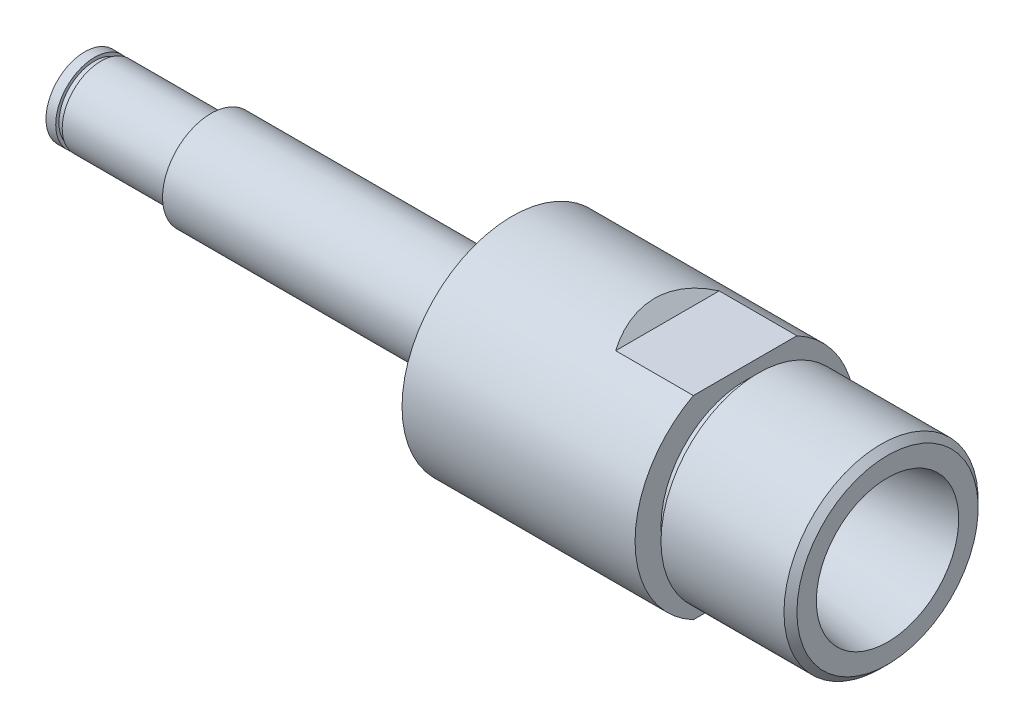
ISO-10303-21;
HEADER;
FILE_DESCRIPTION(('STEP AP214'),'2;1');
FILE_NAME('part.step','',(''),(''),'','','');
FILE_SCHEMA(('AUTOMOTIVE_DESIGN { 1 0 10303 214 1 1 1 1 }'));
ENDSEC;
DATA;
#1=APPLICATION_CONTEXT('core data for automotive mechanical design processes');
#2=APPLICATION_PROTOCOL_DEFINITION('international standard','automotive_design',2000,#1);
#3=PRODUCT_CONTEXT('',#1,'mechanical');
#4=PRODUCT('Part','Part','',(#3));
#5=PRODUCT_RELATED_PRODUCT_CATEGORY('part','',(#4));
#6=PRODUCT_DEFINITION_FORMATION('','',#4);
#7=PRODUCT_DEFINITION_CONTEXT('part definition',#1,'design');
#8=PRODUCT_DEFINITION('design','',#6,#7);
#9=PRODUCT_DEFINITION_SHAPE('','',#8);
#10=(LENGTH_UNIT() NAMED_UNIT(*) SI_UNIT(.MILLI.,.METRE.));
#11=(NAMED_UNIT(*) PLANE_ANGLE_UNIT() SI_UNIT($,.RADIAN.));
#12=(NAMED_UNIT(*) SI_UNIT($,.STERADIAN.) SOLID_ANGLE_UNIT());
#13=UNCERTAINTY_MEASURE_WITH_UNIT(LENGTH_MEASURE(1.E-05),#10,'distance_accuracy_value','');
#14=(GEOMETRIC_REPRESENTATION_CONTEXT(3) GLOBAL_UNCERTAINTY_ASSIGNED_CONTEXT((#13)) GLOBAL_UNIT_ASSIGNED_CONTEXT((#10,
#11,#12)) REPRESENTATION_CONTEXT('',''));
#15=CARTESIAN_POINT('',(0.,0.,0.));
#16=DIRECTION('',(0.,0.,1.));
#17=DIRECTION('',(1.,0.,0.));
#18=AXIS2_PLACEMENT_3D('',#15,#16,#17);
#19=CARTESIAN_POINT('',(-14.7147711853878,0.,0.));
#20=DIRECTION('',(-1.,0.,0.));
#21=DIRECTION('',(0.,0.,1.));
#22=AXIS2_PLACEMENT_3D('',#19,#20,#21);
#23=CYLINDRICAL_SURFACE('',#22,17.);
#24=CARTESIAN_POINT('',(39.0000000000001,0.,0.));
#25=DIRECTION('',(0.707106781186545,0.70710678118655,0.));
#26=DIRECTION('',(-0.70710678118655,0.707106781186545,0.));
#27=AXIS2_PLACEMENT_3D('',#24,#25,#26);
#28=ELLIPSE('',#27,24.0416305603427,17.);
#29=CARTESIAN_POINT('',(24.,15.,8.00000000000001));
#30=VERTEX_POINT('',#29);
#31=CARTESIAN_POINT('',(22.,17.,0.));
#32=VERTEX_POINT('',#31);
#33=EDGE_CURVE('E58',#30,#32,#28,.F.);
#34=ORIENTED_EDGE('',*,*,#33,.T.);
#35=CARTESIAN_POINT('',(39.0000000000001,0.,0.));
#36=DIRECTION('',(0.707106781186545,0.70710678118655,0.));
#37=DIRECTION('',(-0.70710678118655,0.707106781186545,0.));
#38=AXIS2_PLACEMENT_3D('',#35,#36,#37);
#39=ELLIPSE('',#38,24.0416305603427,17.);
#40=CARTESIAN_POINT('',(24.,15.,-8.));
#41=VERTEX_POINT('',#40);
#42=EDGE_CURVE('E96',#32,#41,#39,.F.);
#43=ORIENTED_EDGE('',*,*,#42,.T.);
#44=DIRECTION('',(1.,0.,0.));
#45=VECTOR('',#44,1.);
#46=CARTESIAN_POINT('',(22.,15.,-8.));
#47=LINE('',#46,#45);
#48=CARTESIAN_POINT('',(36.,15.,-8.));
#49=VERTEX_POINT('',#48);
#50=EDGE_CURVE('E91',#41,#49,#47,.T.);
#51=ORIENTED_EDGE('',*,*,#50,.T.);
#52=CARTESIAN_POINT('',(36.,0.,0.));
#53=DIRECTION('',(-1.,0.,0.));
#54=DIRECTION('',(0.,0.,1.));
#55=AXIS2_PLACEMENT_3D('',#52,#53,#54);
#56=CIRCLE('',#55,17.);
#57=CARTESIAN_POINT('',(36.,-15.,-8.));
#58=VERTEX_POINT('',#57);
#59=EDGE_CURVE('E95',#49,#58,#56,.T.);
#60=ORIENTED_EDGE('',*,*,#59,.T.);
#61=DIRECTION('',(1.,0.,0.));
#62=VECTOR('',#61,1.);
#63=CARTESIAN_POINT('',(22.,-15.,-8.));
#64=LINE('',#63,#62);
#65=CARTESIAN_POINT('',(24.,-15.,-8.));
#66=VERTEX_POINT('',#65);
#67=EDGE_CURVE('E101',#66,#58,#64,.T.);
#68=ORIENTED_EDGE('',*,*,#67,.F.);
#69=CARTESIAN_POINT('',(39.0000000000001,0.,0.));
#70=DIRECTION('',(0.707106781186545,-0.70710678118655,0.));
#71=DIRECTION('',(-0.70710678118655,-0.707106781186545,0.));
#72=AXIS2_PLACEMENT_3D('',#69,#70,#71);
#73=ELLIPSE('',#72,24.0416305603427,17.);
#74=CARTESIAN_POINT('',(22.,-17.,0.));
#75=VERTEX_POINT('',#74);
#76=EDGE_CURVE('E65',#66,#75,#73,.F.);
#77=ORIENTED_EDGE('',*,*,#76,.T.);
#78=CARTESIAN_POINT('',(39.0000000000001,0.,0.));
#79=DIRECTION('',(0.707106781186545,-0.70710678118655,0.));
#80=DIRECTION('',(-0.70710678118655,-0.707106781186545,0.));
#81=AXIS2_PLACEMENT_3D('',#78,#79,#80);
#82=ELLIPSE('',#81,24.0416305603427,17.);
#83=CARTESIAN_POINT('',(24.,-15.,8.));
#84=VERTEX_POINT('',#83);
#85=EDGE_CURVE('E133',#75,#84,#82,.F.);
#86=ORIENTED_EDGE('',*,*,#85,.T.);
#87=DIRECTION('',(1.,0.,0.));
#88=VECTOR('',#87,1.);
#89=CARTESIAN_POINT('',(22.,-15.,8.));
#90=LINE('',#89,#88);
#91=CARTESIAN_POINT('',(36.,-15.,8.));
#92=VERTEX_POINT('',#91);
#93=EDGE_CURVE('E109',#84,#92,#90,.T.);
#94=ORIENTED_EDGE('',*,*,#93,.T.);
#95=CARTESIAN_POINT('',(36.,15.,8.00000000000001));
#96=VERTEX_POINT('',#95);
#97=EDGE_CURVE('E116',#92,#96,#56,.T.);
#98=ORIENTED_EDGE('',*,*,#97,.T.);
#99=DIRECTION('',(1.,0.,0.));
#100=VECTOR('',#99,1.);
#101=CARTESIAN_POINT('',(22.,15.,8.00000000000001));
#102=LINE('',#101,#100);
#103=EDGE_CURVE('E100',#30,#96,#102,.T.);
#104=ORIENTED_EDGE('',*,*,#103,.F.);
#105=EDGE_LOOP('',(#34,#43,#51,#60,#68,#77,#86,#94,#98,#104));
#106=FACE_BOUND('',#105,.T.);
#107=CARTESIAN_POINT('',(0.,0.,0.));
#108=DIRECTION('',(-1.,0.,0.));
#109=DIRECTION('',(0.,0.,1.));
#110=AXIS2_PLACEMENT_3D('',#107,#108,#109);
#111=CIRCLE('',#110,17.);
#112=CARTESIAN_POINT('',(0.,0.,17.));
#113=VERTEX_POINT('',#112);
#114=EDGE_CURVE('E115',#113,#113,#111,.T.);
#115=ORIENTED_EDGE('',*,*,#114,.F.);
#116=EDGE_LOOP('',(#115));
#117=FACE_BOUND('',#116,.T.);
#118=ADVANCED_FACE('F42',(#106,#117),#23,.T.);
#119=CARTESIAN_POINT('',(36.,17.,0.));
#120=DIRECTION('',(-1.,0.,0.));
#121=DIRECTION('',(0.,0.,1.));
#122=AXIS2_PLACEMENT_3D('',#119,#120,#121);
#123=PLANE('',#122);
#124=CARTESIAN_POINT('',(36.,0.,0.));
#125=DIRECTION('',(-1.,0.,0.));
#126=DIRECTION('',(0.,0.,1.));
#127=AXIS2_PLACEMENT_3D('',#124,#125,#126);
#128=CIRCLE('',#127,13.);
#129=CARTESIAN_POINT('',(36.,0.,13.));
#130=VERTEX_POINT('',#129);
#131=EDGE_CURVE('E121',#130,#130,#128,.T.);
#132=ORIENTED_EDGE('',*,*,#131,.T.);
#133=EDGE_LOOP('',(#132));
#134=FACE_BOUND('',#133,.T.);
#135=DIRECTION('',(0.,0.,1.));
#136=VECTOR('',#135,1.);
#137=CARTESIAN_POINT('',(36.,15.,8.00000000000001));
#138=LINE('',#137,#136);
#139=EDGE_CURVE('E104',#49,#96,#138,.T.);
#140=ORIENTED_EDGE('',*,*,#139,.T.);
#141=ORIENTED_EDGE('',*,*,#97,.F.);
#142=DIRECTION('',(0.,0.,-1.));
#143=VECTOR('',#142,1.);
#144=CARTESIAN_POINT('',(36.,-15.,8.));
#145=LINE('',#144,#143);
#146=EDGE_CURVE('E110',#92,#58,#145,.T.);
#147=ORIENTED_EDGE('',*,*,#146,.T.);
#148=ORIENTED_EDGE('',*,*,#59,.F.);
#149=EDGE_LOOP('',(#140,#141,#147,#148));
#150=FACE_BOUND('',#149,.T.);
#151=ADVANCED_FACE('F113',(#134,#150),#123,.F.);
#152=CARTESIAN_POINT('',(-14.7147711853878,0.,0.));
#153=DIRECTION('',(-1.,0.,0.));
#154=DIRECTION('',(0.,0.,1.));
#155=AXIS2_PLACEMENT_3D('',#152,#153,#154);
#156=CYLINDRICAL_SURFACE('',#155,6.5);
#157=CARTESIAN_POINT('',(-2.,0.,0.));
#158=DIRECTION('',(-1.,0.,0.));
#159=DIRECTION('',(0.,0.,1.));
#160=AXIS2_PLACEMENT_3D('',#157,#158,#159);
#161=CIRCLE('',#160,6.5);
#162=CARTESIAN_POINT('',(-2.,0.,6.5));
#163=VERTEX_POINT('',#162);
#164=EDGE_CURVE('E193',#163,#163,#161,.T.);
#165=ORIENTED_EDGE('',*,*,#164,.F.);
#166=EDGE_LOOP('',(#165));
#167=FACE_BOUND('',#166,.T.);
#168=CARTESIAN_POINT('',(0.,0.,0.));
#169=DIRECTION('',(-1.,0.,0.));
#170=DIRECTION('',(0.,0.,1.));
#171=AXIS2_PLACEMENT_3D('',#168,#169,#170);
#172=CIRCLE('',#171,6.5);
#173=CARTESIAN_POINT('',(0.,0.,6.5));
#174=VERTEX_POINT('',#173);
#175=EDGE_CURVE('E119',#174,#174,#172,.T.);
#176=ORIENTED_EDGE('',*,*,#175,.T.);
#177=EDGE_LOOP('',(#176));
#178=FACE_BOUND('',#177,.T.);
#179=ADVANCED_FACE('F158',(#167,#178),#156,.T.);
#180=CARTESIAN_POINT('',(0.,6.5,0.));
#181=DIRECTION('',(1.,0.,0.));
#182=DIRECTION('',(0.,0.,-1.));
#183=AXIS2_PLACEMENT_3D('',#180,#181,#182);
#184=PLANE('',#183);
#185=ORIENTED_EDGE('',*,*,#175,.F.);
#186=EDGE_LOOP('',(#185));
#187=FACE_BOUND('',#186,.T.);
#188=ORIENTED_EDGE('',*,*,#114,.T.);
#189=EDGE_LOOP('',(#188));
#190=FACE_BOUND('',#189,.T.);
#191=ADVANCED_FACE('F163',(#187,#190),#184,.F.);
#192=CARTESIAN_POINT('',(-14.7147711853878,0.,0.));
#193=DIRECTION('',(-1.,0.,0.));
#194=DIRECTION('',(0.,0.,1.));
#195=AXIS2_PLACEMENT_3D('',#192,#193,#194);
#196=CYLINDRICAL_SURFACE('',#195,13.);
#197=ORIENTED_EDGE('',*,*,#131,.F.);
#198=EDGE_LOOP('',(#197));
#199=FACE_BOUND('',#198,.T.);
#200=CARTESIAN_POINT('',(38.,0.,0.));
#201=DIRECTION('',(-1.,0.,0.));
#202=DIRECTION('',(0.,0.,1.));
#203=AXIS2_PLACEMENT_3D('',#200,#201,#202);
#204=CIRCLE('',#203,13.);
#205=CARTESIAN_POINT('',(38.,0.,13.));
#206=VERTEX_POINT('',#205);
#207=EDGE_CURVE('E258',#206,#206,#204,.T.);
#208=ORIENTED_EDGE('',*,*,#207,.T.);
#209=EDGE_LOOP('',(#208));
#210=FACE_BOUND('',#209,.T.);
#211=ADVANCED_FACE('F166',(#199,#210),#196,.T.);
#212=CARTESIAN_POINT('',(38.,13.,0.));
#213=DIRECTION('',(1.,0.,0.));
#214=DIRECTION('',(0.,0.,-1.));
#215=AXIS2_PLACEMENT_3D('',#212,#213,#214);
#216=PLANE('',#215);
#217=ORIENTED_EDGE('',*,*,#207,.F.);
#218=EDGE_LOOP('',(#217));
#219=FACE_BOUND('',#218,.T.);
#220=CARTESIAN_POINT('',(38.,0.,0.));
#221=DIRECTION('',(-1.,0.,0.));
#222=DIRECTION('',(0.,0.,1.));
#223=AXIS2_PLACEMENT_3D('',#220,#221,#222);
#224=CIRCLE('',#223,15.);
#225=CARTESIAN_POINT('',(38.,0.,15.));
#226=VERTEX_POINT('',#225);
#227=EDGE_CURVE('E256',#226,#226,#224,.T.);
#228=ORIENTED_EDGE('',*,*,#227,.T.);
#229=EDGE_LOOP('',(#228));
#230=FACE_BOUND('',#229,.T.);
#231=ADVANCED_FACE('F266',(#219,#230),#216,.F.);
#232=CARTESIAN_POINT('',(-14.7147711853878,0.,0.));
#233=DIRECTION('',(-1.,0.,0.));
#234=DIRECTION('',(0.,0.,1.));
#235=AXIS2_PLACEMENT_3D('',#232,#233,#234);
#236=CYLINDRICAL_SURFACE('',#235,15.);
#237=CARTESIAN_POINT('',(57.,0.,0.));
#238=DIRECTION('',(-1.,0.,0.));
#239=DIRECTION('',(0.,0.,1.));
#240=AXIS2_PLACEMENT_3D('',#237,#238,#239);
#241=CIRCLE('',#240,15.);
#242=CARTESIAN_POINT('',(57.,0.,15.));
#243=VERTEX_POINT('',#242);
#244=EDGE_CURVE('E51',#243,#243,#241,.T.);
#245=ORIENTED_EDGE('',*,*,#244,.T.);
#246=EDGE_LOOP('',(#245));
#247=FACE_BOUND('',#246,.T.);
#248=ORIENTED_EDGE('',*,*,#227,.F.);
#249=EDGE_LOOP('',(#248));
#250=FACE_BOUND('',#249,.T.);
#251=ADVANCED_FACE('F139',(#247,#250),#236,.T.);
#252=CARTESIAN_POINT('',(58.,15.,0.));
#253=DIRECTION('',(-1.,0.,0.));
#254=DIRECTION('',(0.,0.,1.));
#255=AXIS2_PLACEMENT_3D('',#252,#253,#254);
#256=PLANE('',#255);
#257=CARTESIAN_POINT('',(58.,0.,0.));
#258=DIRECTION('',(-1.,0.,0.));
#259=DIRECTION('',(0.,0.,1.));
#260=AXIS2_PLACEMENT_3D('',#257,#258,#259);
#261=CIRCLE('',#260,14.);
#262=CARTESIAN_POINT('',(58.,0.,14.));
#263=VERTEX_POINT('',#262);
#264=EDGE_CURVE('E12',#263,#263,#261,.F.);
#265=ORIENTED_EDGE('',*,*,#264,.T.);
#266=EDGE_LOOP('',(#265));
#267=FACE_BOUND('',#266,.T.);
#268=CARTESIAN_POINT('',(58.,0.,0.));
#269=DIRECTION('',(-1.,0.,0.));
#270=DIRECTION('',(0.,0.,1.));
#271=AXIS2_PLACEMENT_3D('',#268,#269,#270);
#272=CIRCLE('',#271,11.);
#273=CARTESIAN_POINT('',(58.,0.,11.));
#274=VERTEX_POINT('',#273);
#275=EDGE_CURVE('E253',#274,#274,#272,.T.);
#276=ORIENTED_EDGE('',*,*,#275,.T.);
#277=EDGE_LOOP('',(#276));
#278=FACE_BOUND('',#277,.T.);
#279=ADVANCED_FACE('F275',(#267,#278),#256,.F.);
#280=CARTESIAN_POINT('',(42.,0.,0.));
#281=DIRECTION('',(1.,0.,0.));
#282=DIRECTION('',(0.,0.,-1.));
#283=AXIS2_PLACEMENT_3D('',#280,#281,#282);
#284=CONICAL_SURFACE('',#283,8.68011040813394,0.143989663289526);
#285=ORIENTED_EDGE('',*,*,#275,.F.);
#286=EDGE_LOOP('',(#285));
#287=FACE_BOUND('',#286,.T.);
#288=CARTESIAN_POINT('',(42.,0.,0.));
#289=DIRECTION('',(-1.,0.,0.));
#290=DIRECTION('',(0.,0.,1.));
#291=AXIS2_PLACEMENT_3D('',#288,#289,#290);
#292=CIRCLE('',#291,8.68011040813394);
#293=CARTESIAN_POINT('',(42.,0.,8.68011040813394));
#294=VERTEX_POINT('',#293);
#295=EDGE_CURVE('E250',#294,#294,#292,.T.);
#296=ORIENTED_EDGE('',*,*,#295,.T.);
#297=EDGE_LOOP('',(#296));
#298=FACE_BOUND('',#297,.T.);
#299=ADVANCED_FACE('F277',(#287,#298),#284,.F.);
#300=CARTESIAN_POINT('',(42.,8.68011040813394,0.));
#301=DIRECTION('',(1.,0.,0.));
#302=DIRECTION('',(0.,0.,-1.));
#303=AXIS2_PLACEMENT_3D('',#300,#301,#302);
#304=PLANE('',#303);
#305=ORIENTED_EDGE('',*,*,#295,.F.);
#306=EDGE_LOOP('',(#305));
#307=FACE_BOUND('',#306,.T.);
#308=CARTESIAN_POINT('',(42.,0.,0.));
#309=DIRECTION('',(-1.,0.,0.));
#310=DIRECTION('',(0.,0.,1.));
#311=AXIS2_PLACEMENT_3D('',#308,#309,#310);
#312=CIRCLE('',#311,9.5);
#313=CARTESIAN_POINT('',(42.,0.,9.5));
#314=VERTEX_POINT('',#313);
#315=EDGE_CURVE('E247',#314,#314,#312,.T.);
#316=ORIENTED_EDGE('',*,*,#315,.T.);
#317=EDGE_LOOP('',(#316));
#318=FACE_BOUND('',#317,.T.);
#319=ADVANCED_FACE('F281',(#307,#318),#304,.F.);
#320=CARTESIAN_POINT('',(-14.7147711853878,0.,0.));
#321=DIRECTION('',(-1.,0.,0.));
#322=DIRECTION('',(0.,0.,1.));
#323=AXIS2_PLACEMENT_3D('',#320,#321,#322);
#324=CYLINDRICAL_SURFACE('',#323,9.5);
#325=ORIENTED_EDGE('',*,*,#315,.F.);
#326=EDGE_LOOP('',(#325));
#327=FACE_BOUND('',#326,.T.);
#328=CARTESIAN_POINT('',(37.,0.,0.));
#329=DIRECTION('',(-1.,0.,0.));
#330=DIRECTION('',(0.,0.,1.));
#331=AXIS2_PLACEMENT_3D('',#328,#329,#330);
#332=CIRCLE('',#331,9.5);
#333=CARTESIAN_POINT('',(37.,0.,9.5));
#334=VERTEX_POINT('',#333);
#335=EDGE_CURVE('E244',#334,#334,#332,.T.);
#336=ORIENTED_EDGE('',*,*,#335,.T.);
#337=EDGE_LOOP('',(#336));
#338=FACE_BOUND('',#337,.T.);
#339=ADVANCED_FACE('F285',(#327,#338),#324,.F.);
#340=CARTESIAN_POINT('',(37.,9.5,0.));
#341=DIRECTION('',(-1.,0.,0.));
#342=DIRECTION('',(0.,0.,1.));
#343=AXIS2_PLACEMENT_3D('',#340,#341,#342);
#344=PLANE('',#343);
#345=ORIENTED_EDGE('',*,*,#335,.F.);
#346=EDGE_LOOP('',(#345));
#347=FACE_BOUND('',#346,.T.);
#348=CARTESIAN_POINT('',(37.,0.,0.));
#349=DIRECTION('',(-1.,0.,0.));
#350=DIRECTION('',(0.,0.,1.));
#351=AXIS2_PLACEMENT_3D('',#348,#349,#350);
#352=CIRCLE('',#351,9.);
#353=CARTESIAN_POINT('',(37.,0.,9.));
#354=VERTEX_POINT('',#353);
#355=EDGE_CURVE('E241',#354,#354,#352,.T.);
#356=ORIENTED_EDGE('',*,*,#355,.T.);
#357=EDGE_LOOP('',(#356));
#358=FACE_BOUND('',#357,.T.);
#359=ADVANCED_FACE('F289',(#347,#358),#344,.F.);
#360=CARTESIAN_POINT('',(-14.7147711853878,0.,0.));
#361=DIRECTION('',(-1.,0.,0.));
#362=DIRECTION('',(0.,0.,1.));
#363=AXIS2_PLACEMENT_3D('',#360,#361,#362);
#364=CYLINDRICAL_SURFACE('',#363,9.);
#365=ORIENTED_EDGE('',*,*,#355,.F.);
#366=EDGE_LOOP('',(#365));
#367=FACE_BOUND('',#366,.T.);
#368=CARTESIAN_POINT('',(31.,0.,0.));
#369=DIRECTION('',(-1.,0.,0.));
#370=DIRECTION('',(0.,0.,1.));
#371=AXIS2_PLACEMENT_3D('',#368,#369,#370);
#372=CIRCLE('',#371,9.);
#373=CARTESIAN_POINT('',(31.,0.,9.));
#374=VERTEX_POINT('',#373);
#375=EDGE_CURVE('E238',#374,#374,#372,.T.);
#376=ORIENTED_EDGE('',*,*,#375,.T.);
#377=EDGE_LOOP('',(#376));
#378=FACE_BOUND('',#377,.T.);
#379=ADVANCED_FACE('F293',(#367,#378),#364,.F.);
#380=CARTESIAN_POINT('',(31.,9.,0.));
#381=DIRECTION('',(1.,0.,0.));
#382=DIRECTION('',(0.,0.,-1.));
#383=AXIS2_PLACEMENT_3D('',#380,#381,#382);
#384=PLANE('',#383);
#385=ORIENTED_EDGE('',*,*,#375,.F.);
#386=EDGE_LOOP('',(#385));
#387=FACE_BOUND('',#386,.T.);
#388=CARTESIAN_POINT('',(31.,0.,0.));
#389=DIRECTION('',(-1.,0.,0.));
#390=DIRECTION('',(0.,0.,1.));
#391=AXIS2_PLACEMENT_3D('',#388,#389,#390);
#392=CIRCLE('',#391,9.5);
#393=CARTESIAN_POINT('',(31.,0.,9.5));
#394=VERTEX_POINT('',#393);
#395=EDGE_CURVE('E235',#394,#394,#392,.T.);
#396=ORIENTED_EDGE('',*,*,#395,.T.);
#397=EDGE_LOOP('',(#396));
#398=FACE_BOUND('',#397,.T.);
#399=ADVANCED_FACE('F297',(#387,#398),#384,.F.);
#400=CARTESIAN_POINT('',(-14.7147711853878,0.,0.));
#401=DIRECTION('',(-1.,0.,0.));
#402=DIRECTION('',(0.,0.,1.));
#403=AXIS2_PLACEMENT_3D('',#400,#401,#402);
#404=CYLINDRICAL_SURFACE('',#403,9.5);
#405=ORIENTED_EDGE('',*,*,#395,.F.);
#406=EDGE_LOOP('',(#405));
#407=FACE_BOUND('',#406,.T.);
#408=CARTESIAN_POINT('',(26.,0.,0.));
#409=DIRECTION('',(-1.,0.,0.));
#410=DIRECTION('',(0.,0.,1.));
#411=AXIS2_PLACEMENT_3D('',#408,#409,#410);
#412=CIRCLE('',#411,9.5);
#413=CARTESIAN_POINT('',(26.,0.,9.5));
#414=VERTEX_POINT('',#413);
#415=EDGE_CURVE('E232',#414,#414,#412,.T.);
#416=ORIENTED_EDGE('',*,*,#415,.T.);
#417=EDGE_LOOP('',(#416));
#418=FACE_BOUND('',#417,.T.);
#419=ADVANCED_FACE('F301',(#407,#418),#404,.F.);
#420=CARTESIAN_POINT('',(26.,9.5,0.));
#421=DIRECTION('',(-1.,0.,0.));
#422=DIRECTION('',(0.,0.,1.));
#423=AXIS2_PLACEMENT_3D('',#420,#421,#422);
#424=PLANE('',#423);
#425=ORIENTED_EDGE('',*,*,#415,.F.);
#426=EDGE_LOOP('',(#425));
#427=FACE_BOUND('',#426,.T.);
#428=CARTESIAN_POINT('',(26.,0.,0.));
#429=DIRECTION('',(-1.,0.,0.));
#430=DIRECTION('',(0.,0.,1.));
#431=AXIS2_PLACEMENT_3D('',#428,#429,#430);
#432=CIRCLE('',#431,7.);
#433=CARTESIAN_POINT('',(26.,0.,7.));
#434=VERTEX_POINT('',#433);
#435=EDGE_CURVE('E229',#434,#434,#432,.T.);
#436=ORIENTED_EDGE('',*,*,#435,.T.);
#437=EDGE_LOOP('',(#436));
#438=FACE_BOUND('',#437,.T.);
#439=ADVANCED_FACE('F305',(#427,#438),#424,.F.);
#440=CARTESIAN_POINT('',(-14.7147711853878,0.,0.));
#441=DIRECTION('',(-1.,0.,0.));
#442=DIRECTION('',(0.,0.,1.));
#443=AXIS2_PLACEMENT_3D('',#440,#441,#442);
#444=CYLINDRICAL_SURFACE('',#443,7.);
#445=ORIENTED_EDGE('',*,*,#435,.F.);
#446=EDGE_LOOP('',(#445));
#447=FACE_BOUND('',#446,.T.);
#448=CARTESIAN_POINT('',(10.,0.,0.));
#449=DIRECTION('',(-1.,0.,0.));
#450=DIRECTION('',(0.,0.,1.));
#451=AXIS2_PLACEMENT_3D('',#448,#449,#450);
#452=CIRCLE('',#451,7.);
#453=CARTESIAN_POINT('',(10.,0.,7.));
#454=VERTEX_POINT('',#453);
#455=EDGE_CURVE('E226',#454,#454,#452,.T.);
#456=ORIENTED_EDGE('',*,*,#455,.T.);
#457=EDGE_LOOP('',(#456));
#458=FACE_BOUND('',#457,.T.);
#459=ADVANCED_FACE('F309',(#447,#458),#444,.F.);
#460=CARTESIAN_POINT('',(5.79397566680704,0.,0.));
#461=DIRECTION('',(1.,0.,0.));
#462=DIRECTION('',(0.,0.,-1.));
#463=AXIS2_PLACEMENT_3D('',#460,#461,#462);
#464=CONICAL_SURFACE('',#463,0.,1.02974425867665);
#465=ORIENTED_EDGE('',*,*,#455,.F.);
#466=EDGE_LOOP('',(#465));
#467=FACE_BOUND('',#466,.T.);
#468=CARTESIAN_POINT('',(5.79397566680704,0.,0.));
#469=VERTEX_POINT('',#468);
#470=VERTEX_LOOP('',#469);
#471=FACE_BOUND('',#470,.T.);
#472=ADVANCED_FACE('F313',(#467,#471),#464,.F.);
#473=CARTESIAN_POINT('',(-66.,5.99999999999999,0.));
#474=DIRECTION('',(1.,0.,0.));
#475=DIRECTION('',(0.,0.,-1.));
#476=AXIS2_PLACEMENT_3D('',#473,#474,#475);
#477=PLANE('',#476);
#478=CARTESIAN_POINT('',(-66.,0.,0.));
#479=DIRECTION('',(-1.,0.,0.));
#480=DIRECTION('',(0.,0.,1.));
#481=AXIS2_PLACEMENT_3D('',#478,#479,#480);
#482=CIRCLE('',#481,5.99999999999999);
#483=CARTESIAN_POINT('',(-66.,0.,5.99999999999999));
#484=VERTEX_POINT('',#483);
#485=EDGE_CURVE('E223',#484,#484,#482,.T.);
#486=ORIENTED_EDGE('',*,*,#485,.T.);
#487=EDGE_LOOP('',(#486));
#488=FACE_BOUND('',#487,.T.);
#489=ADVANCED_FACE('F317',(#488),#477,.F.);
#490=CARTESIAN_POINT('',(-14.7147711853878,0.,0.));
#491=DIRECTION('',(-1.,0.,0.));
#492=DIRECTION('',(0.,0.,1.));
#493=AXIS2_PLACEMENT_3D('',#490,#491,#492);
#494=CYLINDRICAL_SURFACE('',#493,6.);
#495=ORIENTED_EDGE('',*,*,#485,.F.);
#496=EDGE_LOOP('',(#495));
#497=FACE_BOUND('',#496,.T.);
#498=CARTESIAN_POINT('',(-64.5,0.,0.));
#499=DIRECTION('',(-1.,0.,0.));
#500=DIRECTION('',(0.,0.,1.));
#501=AXIS2_PLACEMENT_3D('',#498,#499,#500);
#502=CIRCLE('',#501,6.);
#503=CARTESIAN_POINT('',(-64.5,0.,6.));
#504=VERTEX_POINT('',#503);
#505=EDGE_CURVE('E220',#504,#504,#502,.T.);
#506=ORIENTED_EDGE('',*,*,#505,.T.);
#507=EDGE_LOOP('',(#506));
#508=FACE_BOUND('',#507,.T.);
#509=ADVANCED_FACE('F321',(#497,#508),#494,.T.);
#510=CARTESIAN_POINT('',(-64.5,5.5,0.));
#511=DIRECTION('',(-1.,0.,0.));
#512=DIRECTION('',(0.,0.,1.));
#513=AXIS2_PLACEMENT_3D('',#510,#511,#512);
#514=PLANE('',#513);
#515=ORIENTED_EDGE('',*,*,#505,.F.);
#516=EDGE_LOOP('',(#515));
#517=FACE_BOUND('',#516,.T.);
#518=CARTESIAN_POINT('',(-64.5,0.,0.));
#519=DIRECTION('',(-1.,0.,0.));
#520=DIRECTION('',(0.,0.,1.));
#521=AXIS2_PLACEMENT_3D('',#518,#519,#520);
#522=CIRCLE('',#521,5.5);
#523=CARTESIAN_POINT('',(-64.5,0.,5.5));
#524=VERTEX_POINT('',#523);
#525=EDGE_CURVE('E217',#524,#524,#522,.T.);
#526=ORIENTED_EDGE('',*,*,#525,.T.);
#527=EDGE_LOOP('',(#526));
#528=FACE_BOUND('',#527,.T.);
#529=ADVANCED_FACE('F325',(#517,#528),#514,.F.);
#530=CARTESIAN_POINT('',(-14.7147711853878,0.,0.));
#531=DIRECTION('',(-1.,0.,0.));
#532=DIRECTION('',(0.,0.,1.));
#533=AXIS2_PLACEMENT_3D('',#530,#531,#532);
#534=CYLINDRICAL_SURFACE('',#533,5.5);
#535=ORIENTED_EDGE('',*,*,#525,.F.);
#536=EDGE_LOOP('',(#535));
#537=FACE_BOUND('',#536,.T.);
#538=CARTESIAN_POINT('',(-63.5,0.,0.));
#539=DIRECTION('',(-1.,0.,0.));
#540=DIRECTION('',(0.,0.,1.));
#541=AXIS2_PLACEMENT_3D('',#538,#539,#540);
#542=CIRCLE('',#541,5.5);
#543=CARTESIAN_POINT('',(-63.5,0.,5.5));
#544=VERTEX_POINT('',#543);
#545=EDGE_CURVE('E214',#544,#544,#542,.T.);
#546=ORIENTED_EDGE('',*,*,#545,.T.);
#547=EDGE_LOOP('',(#546));
#548=FACE_BOUND('',#547,.T.);
#549=ADVANCED_FACE('F329',(#537,#548),#534,.T.);
#550=CARTESIAN_POINT('',(-63.5,6.,0.));
#551=DIRECTION('',(1.,0.,0.));
#552=DIRECTION('',(0.,0.,-1.));
#553=AXIS2_PLACEMENT_3D('',#550,#551,#552);
#554=PLANE('',#553);
#555=ORIENTED_EDGE('',*,*,#545,.F.);
#556=EDGE_LOOP('',(#555));
#557=FACE_BOUND('',#556,.T.);
#558=CARTESIAN_POINT('',(-63.5,0.,0.));
#559=DIRECTION('',(-1.,0.,0.));
#560=DIRECTION('',(0.,0.,1.));
#561=AXIS2_PLACEMENT_3D('',#558,#559,#560);
#562=CIRCLE('',#561,6.);
#563=CARTESIAN_POINT('',(-63.5,0.,6.));
#564=VERTEX_POINT('',#563);
#565=EDGE_CURVE('E211',#564,#564,#562,.T.);
#566=ORIENTED_EDGE('',*,*,#565,.T.);
#567=EDGE_LOOP('',(#566));
#568=FACE_BOUND('',#567,.T.);
#569=ADVANCED_FACE('F333',(#557,#568),#554,.F.);
#570=CARTESIAN_POINT('',(-14.7147711853878,0.,0.));
#571=DIRECTION('',(-1.,0.,0.));
#572=DIRECTION('',(0.,0.,1.));
#573=AXIS2_PLACEMENT_3D('',#570,#571,#572);
#574=CYLINDRICAL_SURFACE('',#573,6.);
#575=ORIENTED_EDGE('',*,*,#565,.F.);
#576=EDGE_LOOP('',(#575));
#577=FACE_BOUND('',#576,.T.);
#578=CARTESIAN_POINT('',(-47.5,0.,0.));
#579=DIRECTION('',(-1.,0.,0.));
#580=DIRECTION('',(0.,0.,1.));
#581=AXIS2_PLACEMENT_3D('',#578,#579,#580);
#582=CIRCLE('',#581,6.);
#583=CARTESIAN_POINT('',(-47.5,0.,6.));
#584=VERTEX_POINT('',#583);
#585=EDGE_CURVE('E208',#584,#584,#582,.T.);
#586=ORIENTED_EDGE('',*,*,#585,.T.);
#587=EDGE_LOOP('',(#586));
#588=FACE_BOUND('',#587,.T.);
#589=ADVANCED_FACE('F337',(#577,#588),#574,.T.);
#590=CARTESIAN_POINT('',(-47.5,5.5,0.));
#591=DIRECTION('',(-1.,0.,0.));
#592=DIRECTION('',(0.,0.,1.));
#593=AXIS2_PLACEMENT_3D('',#590,#591,#592);
#594=PLANE('',#593);
#595=ORIENTED_EDGE('',*,*,#585,.F.);
#596=EDGE_LOOP('',(#595));
#597=FACE_BOUND('',#596,.T.);
#598=CARTESIAN_POINT('',(-47.5,0.,0.));
#599=DIRECTION('',(-1.,0.,0.));
#600=DIRECTION('',(0.,0.,1.));
#601=AXIS2_PLACEMENT_3D('',#598,#599,#600);
#602=CIRCLE('',#601,5.5);
#603=CARTESIAN_POINT('',(-47.5,0.,5.5));
#604=VERTEX_POINT('',#603);
#605=EDGE_CURVE('E205',#604,#604,#602,.T.);
#606=ORIENTED_EDGE('',*,*,#605,.T.);
#607=EDGE_LOOP('',(#606));
#608=FACE_BOUND('',#607,.T.);
#609=ADVANCED_FACE('F341',(#597,#608),#594,.F.);
#610=CARTESIAN_POINT('',(-14.7147711853878,0.,0.));
#611=DIRECTION('',(-1.,0.,0.));
#612=DIRECTION('',(0.,0.,1.));
#613=AXIS2_PLACEMENT_3D('',#610,#611,#612);
#614=CYLINDRICAL_SURFACE('',#613,5.5);
#615=ORIENTED_EDGE('',*,*,#605,.F.);
#616=EDGE_LOOP('',(#615));
#617=FACE_BOUND('',#616,.T.);
#618=CARTESIAN_POINT('',(-46.5,0.,0.));
#619=DIRECTION('',(-1.,0.,0.));
#620=DIRECTION('',(0.,0.,1.));
#621=AXIS2_PLACEMENT_3D('',#618,#619,#620);
#622=CIRCLE('',#621,5.5);
#623=CARTESIAN_POINT('',(-46.5,0.,5.5));
#624=VERTEX_POINT('',#623);
#625=EDGE_CURVE('E202',#624,#624,#622,.T.);
#626=ORIENTED_EDGE('',*,*,#625,.T.);
#627=EDGE_LOOP('',(#626));
#628=FACE_BOUND('',#627,.T.);
#629=ADVANCED_FACE('F345',(#617,#628),#614,.T.);
#630=CARTESIAN_POINT('',(-46.5,7.49999999999999,0.));
#631=DIRECTION('',(1.,0.,0.));
#632=DIRECTION('',(0.,0.,-1.));
#633=AXIS2_PLACEMENT_3D('',#630,#631,#632);
#634=PLANE('',#633);
#635=ORIENTED_EDGE('',*,*,#625,.F.);
#636=EDGE_LOOP('',(#635));
#637=FACE_BOUND('',#636,.T.);
#638=CARTESIAN_POINT('',(-46.5,0.,0.));
#639=DIRECTION('',(-1.,0.,0.));
#640=DIRECTION('',(0.,0.,1.));
#641=AXIS2_PLACEMENT_3D('',#638,#639,#640);
#642=CIRCLE('',#641,7.49999999999999);
#643=CARTESIAN_POINT('',(-46.5,0.,7.49999999999999));
#644=VERTEX_POINT('',#643);
#645=EDGE_CURVE('E199',#644,#644,#642,.T.);
#646=ORIENTED_EDGE('',*,*,#645,.T.);
#647=EDGE_LOOP('',(#646));
#648=FACE_BOUND('',#647,.T.);
#649=ADVANCED_FACE('F349',(#637,#648),#634,.F.);
#650=CARTESIAN_POINT('',(-14.7147711853878,0.,0.));
#651=DIRECTION('',(-1.,0.,0.));
#652=DIRECTION('',(0.,0.,1.));
#653=AXIS2_PLACEMENT_3D('',#650,#651,#652);
#654=CYLINDRICAL_SURFACE('',#653,7.5);
#655=ORIENTED_EDGE('',*,*,#645,.F.);
#656=EDGE_LOOP('',(#655));
#657=FACE_BOUND('',#656,.T.);
#658=CARTESIAN_POINT('',(-2.,0.,0.));
#659=DIRECTION('',(-1.,0.,0.));
#660=DIRECTION('',(0.,0.,1.));
#661=AXIS2_PLACEMENT_3D('',#658,#659,#660);
#662=CIRCLE('',#661,7.5);
#663=CARTESIAN_POINT('',(-2.,0.,7.5));
#664=VERTEX_POINT('',#663);
#665=EDGE_CURVE('E196',#664,#664,#662,.T.);
#666=ORIENTED_EDGE('',*,*,#665,.T.);
#667=EDGE_LOOP('',(#666));
#668=FACE_BOUND('',#667,.T.);
#669=ADVANCED_FACE('F353',(#657,#668),#654,.T.);
#670=CARTESIAN_POINT('',(-2.,6.5,0.));
#671=DIRECTION('',(-1.,0.,0.));
#672=DIRECTION('',(0.,0.,1.));
#673=AXIS2_PLACEMENT_3D('',#670,#671,#672);
#674=PLANE('',#673);
#675=ORIENTED_EDGE('',*,*,#665,.F.);
#676=EDGE_LOOP('',(#675));
#677=FACE_BOUND('',#676,.T.);
#678=ORIENTED_EDGE('',*,*,#164,.T.);
#679=EDGE_LOOP('',(#678));
#680=FACE_BOUND('',#679,.T.);
#681=ADVANCED_FACE('F357',(#677,#680),#674,.F.);
#682=CARTESIAN_POINT('',(22.,-15.,8.));
#683=DIRECTION('',(0.,-1.,0.));
#684=DIRECTION('',(0.,0.,-1.));
#685=AXIS2_PLACEMENT_3D('',#682,#683,#684);
#686=PLANE('',#685);
#687=ORIENTED_EDGE('',*,*,#93,.F.);
#688=DIRECTION('',(0.,0.,-1.));
#689=VECTOR('',#688,1.);
#690=CARTESIAN_POINT('',(24.,-15.,-8.));
#691=LINE('',#690,#689);
#692=EDGE_CURVE('E127',#84,#66,#691,.T.);
#693=ORIENTED_EDGE('',*,*,#692,.T.);
#694=ORIENTED_EDGE('',*,*,#67,.T.);
#695=ORIENTED_EDGE('',*,*,#146,.F.);
#696=EDGE_LOOP('',(#687,#693,#694,#695));
#697=FACE_BOUND('',#696,.T.);
#698=ADVANCED_FACE('F184',(#697),#686,.T.);
#699=CARTESIAN_POINT('',(22.,15.,8.00000000000001));
#700=DIRECTION('',(0.,1.,0.));
#701=DIRECTION('',(0.,0.,1.));
#702=AXIS2_PLACEMENT_3D('',#699,#700,#701);
#703=PLANE('',#702);
#704=ORIENTED_EDGE('',*,*,#50,.F.);
#705=DIRECTION('',(0.,0.,1.));
#706=VECTOR('',#705,1.);
#707=CARTESIAN_POINT('',(24.,15.,8.00000000000001));
#708=LINE('',#707,#706);
#709=EDGE_CURVE('E130',#41,#30,#708,.T.);
#710=ORIENTED_EDGE('',*,*,#709,.T.);
#711=ORIENTED_EDGE('',*,*,#103,.T.);
#712=ORIENTED_EDGE('',*,*,#139,.F.);
#713=EDGE_LOOP('',(#704,#710,#711,#712));
#714=FACE_BOUND('',#713,.T.);
#715=ADVANCED_FACE('F105',(#714),#703,.T.);
#716=CARTESIAN_POINT('',(24.,-15.,8.));
#717=DIRECTION('',(0.707106781186545,-0.70710678118655,0.));
#718=DIRECTION('',(0.,0.,1.));
#719=AXIS2_PLACEMENT_3D('',#716,#717,#718);
#720=PLANE('',#719);
#721=ORIENTED_EDGE('',*,*,#692,.F.);
#722=ORIENTED_EDGE('',*,*,#85,.F.);
#723=ORIENTED_EDGE('',*,*,#76,.F.);
#724=EDGE_LOOP('',(#721,#722,#723));
#725=FACE_BOUND('',#724,.T.);
#726=ADVANCED_FACE('F149',(#725),#720,.T.);
#727=CARTESIAN_POINT('',(24.,15.,8.00000000000001));
#728=DIRECTION('',(0.707106781186545,0.70710678118655,0.));
#729=DIRECTION('',(0.,0.,-1.));
#730=AXIS2_PLACEMENT_3D('',#727,#728,#729);
#731=PLANE('',#730);
#732=ORIENTED_EDGE('',*,*,#709,.F.);
#733=ORIENTED_EDGE('',*,*,#42,.F.);
#734=ORIENTED_EDGE('',*,*,#33,.F.);
#735=EDGE_LOOP('',(#732,#733,#734));
#736=FACE_BOUND('',#735,.T.);
#737=ADVANCED_FACE('F143',(#736),#731,.T.);
#738=CARTESIAN_POINT('',(57.,0.,0.));
#739=DIRECTION('',(-1.,0.,0.));
#740=DIRECTION('',(0.,0.,1.));
#741=AXIS2_PLACEMENT_3D('',#738,#739,#740);
#742=CONICAL_SURFACE('',#741,15.,0.785398163397455);
#743=ORIENTED_EDGE('',*,*,#264,.F.);
#744=EDGE_LOOP('',(#743));
#745=FACE_BOUND('',#744,.T.);
#746=ORIENTED_EDGE('',*,*,#244,.F.);
#747=EDGE_LOOP('',(#746));
#748=FACE_BOUND('',#747,.T.);
#749=ADVANCED_FACE('F45',(#745,#748),#742,.T.);
#750=CLOSED_SHELL('',(#118,#151,#179,#191,#211,#231,#251,#279,#299,#319,#339,#359,#379,#399,
#419,#439,#459,#472,#489,#509,#529,#549,#569,#589,#609,#629,#649,#669,#681,#698,#715,#726,#737,#749));
#751=MANIFOLD_SOLID_BREP('B2',#750);
#752=ADVANCED_BREP_SHAPE_REPRESENTATION('',(#18,#751),#14);
#753=SHAPE_DEFINITION_REPRESENTATION(#9,#752);
ENDSEC;
END-ISO-10303-21;
